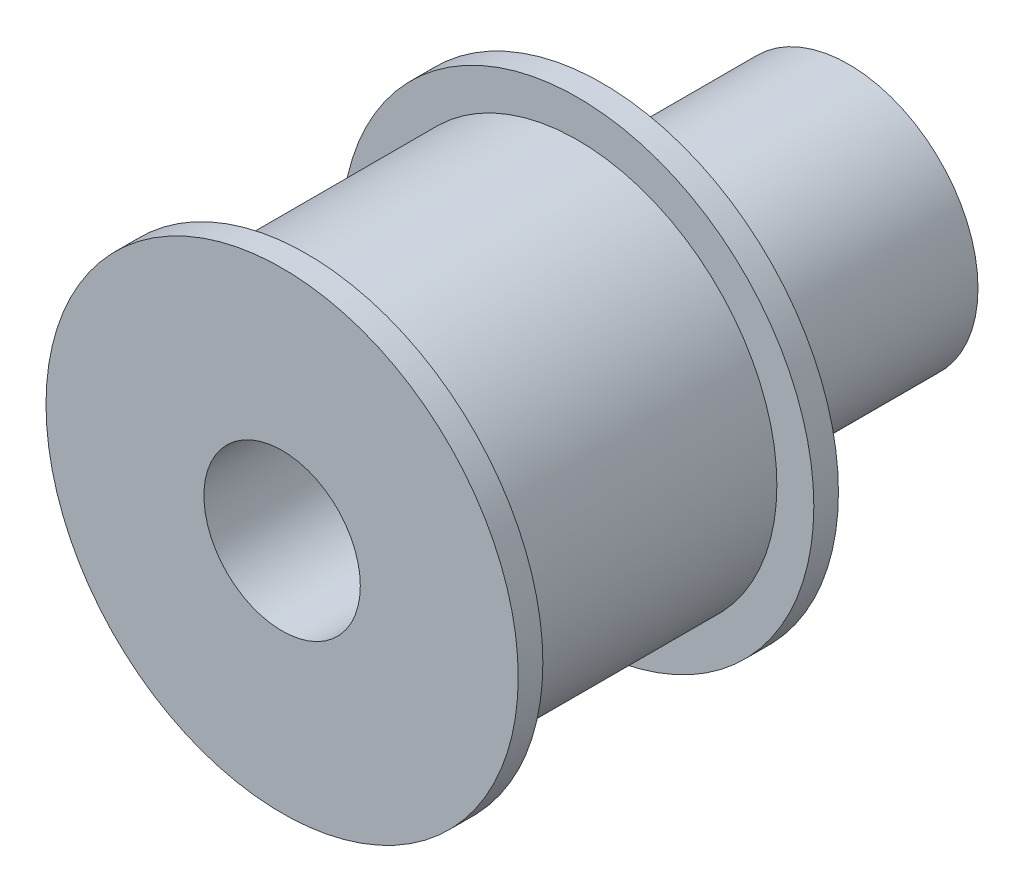
ISO-10303-21;
HEADER;
FILE_DESCRIPTION(('STEP AP214'),'2;1');
FILE_NAME('part.step','',(''),(''),'','','');
FILE_SCHEMA(('AUTOMOTIVE_DESIGN { 1 0 10303 214 1 1 1 1 }'));
ENDSEC;
DATA;
#1=APPLICATION_CONTEXT('core data for automotive mechanical design processes');
#2=APPLICATION_PROTOCOL_DEFINITION('international standard','automotive_design',2000,#1);
#3=PRODUCT_CONTEXT('',#1,'mechanical');
#4=PRODUCT('Part','Part','',(#3));
#5=PRODUCT_RELATED_PRODUCT_CATEGORY('part','',(#4));
#6=PRODUCT_DEFINITION_FORMATION('','',#4);
#7=PRODUCT_DEFINITION_CONTEXT('part definition',#1,'design');
#8=PRODUCT_DEFINITION('design','',#6,#7);
#9=PRODUCT_DEFINITION_SHAPE('','',#8);
#10=(LENGTH_UNIT() NAMED_UNIT(*) SI_UNIT(.MILLI.,.METRE.));
#11=(NAMED_UNIT(*) PLANE_ANGLE_UNIT() SI_UNIT($,.RADIAN.));
#12=(NAMED_UNIT(*) SI_UNIT($,.STERADIAN.) SOLID_ANGLE_UNIT());
#13=UNCERTAINTY_MEASURE_WITH_UNIT(LENGTH_MEASURE(1.E-05),#10,'distance_accuracy_value','');
#14=(GEOMETRIC_REPRESENTATION_CONTEXT(3) GLOBAL_UNCERTAINTY_ASSIGNED_CONTEXT((#13)) GLOBAL_UNIT_ASSIGNED_CONTEXT((#10,
#11,#12)) REPRESENTATION_CONTEXT('',''));
#15=CARTESIAN_POINT('',(0.,0.,0.));
#16=DIRECTION('',(0.,0.,1.));
#17=DIRECTION('',(1.,0.,0.));
#18=AXIS2_PLACEMENT_3D('',#15,#16,#17);
#19=CARTESIAN_POINT('',(0.,0.,-23.));
#20=DIRECTION('',(0.,0.,1.));
#21=DIRECTION('',(1.,0.,0.));
#22=AXIS2_PLACEMENT_3D('',#19,#20,#21);
#23=PLANE('',#22);
#24=CARTESIAN_POINT('',(0.,0.,-23.));
#25=DIRECTION('',(0.,0.,1.));
#26=DIRECTION('',(1.,0.,0.));
#27=AXIS2_PLACEMENT_3D('',#24,#25,#26);
#28=CIRCLE('',#27,3.175);
#29=CARTESIAN_POINT('',(3.175,0.,-23.));
#30=VERTEX_POINT('',#29);
#31=EDGE_CURVE('E77',#30,#30,#28,.T.);
#32=ORIENTED_EDGE('',*,*,#31,.T.);
#33=EDGE_LOOP('',(#32));
#34=FACE_BOUND('',#33,.T.);
#35=CARTESIAN_POINT('',(0.,0.,-23.));
#36=DIRECTION('',(0.,0.,1.));
#37=DIRECTION('',(1.,0.,0.));
#38=AXIS2_PLACEMENT_3D('',#35,#36,#37);
#39=CIRCLE('',#38,5.24999999999998);
#40=CARTESIAN_POINT('',(5.24999999999998,0.,-23.));
#41=VERTEX_POINT('',#40);
#42=EDGE_CURVE('E10',#41,#41,#39,.T.);
#43=ORIENTED_EDGE('',*,*,#42,.F.);
#44=EDGE_LOOP('',(#43));
#45=FACE_BOUND('',#44,.T.);
#46=ADVANCED_FACE('F32',(#34,#45),#23,.F.);
#47=CARTESIAN_POINT('',(0.,0.,0.));
#48=DIRECTION('',(0.,0.,1.));
#49=DIRECTION('',(1.,0.,0.));
#50=AXIS2_PLACEMENT_3D('',#47,#48,#49);
#51=CYLINDRICAL_SURFACE('',#50,5.24999999999998);
#52=CARTESIAN_POINT('',(-5.24999999999998,0.,-19.5));
#53=CARTESIAN_POINT('',(-5.24999901970754,0.0824661767829382,-19.4999985453285));
#54=CARTESIAN_POINT('',(-5.2480381305153,0.164947310904436,-19.4931766582679));
#55=CARTESIAN_POINT('',(-5.24040679458825,0.32751899339774,-19.4661267974233));
#56=CARTESIAN_POINT('',(-5.23473494407561,0.40760862512221,-19.4458937504444));
#57=CARTESIAN_POINT('',(-5.22030518511802,0.563028225553401,-19.3927439711876));
#58=CARTESIAN_POINT('',(-5.21155158079754,0.638364660636167,-19.359844922886));
#59=CARTESIAN_POINT('',(-5.19187483737406,0.782451570846952,-19.2823665063912));
#60=CARTESIAN_POINT('',(-5.18095147131015,0.851201355883621,-19.2377859161322));
#61=CARTESIAN_POINT('',(-5.15778550969183,0.981970835144206,-19.1369737419953));
#62=CARTESIAN_POINT('',(-5.14551781458891,1.0437927917857,-19.0804914346085));
#63=CARTESIAN_POINT('',(-5.12120051186729,1.15722851844326,-18.9580141926467));
#64=CARTESIAN_POINT('',(-5.10915093719506,1.20884075780837,-18.8920178342758));
#65=CARTESIAN_POINT('',(-5.08637261156539,1.30139842504823,-18.7507548129068));
#66=CARTESIAN_POINT('',(-5.07567526879511,1.34210865827511,-18.6753285112013));
#67=CARTESIAN_POINT('',(-5.05718507880498,1.41018877915485,-18.5183459911869));
#68=CARTESIAN_POINT('',(-5.04939160683651,1.43756153666789,-18.4367910959468));
#69=CARTESIAN_POINT('',(-5.0378520614701,1.47748824760406,-18.2720739276258));
#70=CARTESIAN_POINT('',(-5.03400733927506,1.49040414902137,-18.1890064779241));
#71=CARTESIAN_POINT('',(-5.03050656151494,1.50218000841888,-18.0218016386654));
#72=CARTESIAN_POINT('',(-5.03084959580707,1.50104302057215,-17.9376644855623));
#73=CARTESIAN_POINT('',(-5.03559775807448,1.48503101072177,-17.7735985414079));
#74=CARTESIAN_POINT('',(-5.0398708702345,1.47060244296293,-17.6936217366144));
#75=CARTESIAN_POINT('',(-5.05178511287106,1.42913539564342,-17.5372745852793));
#76=CARTESIAN_POINT('',(-5.059426547823,1.40209577610937,-17.4609045654596));
#77=CARTESIAN_POINT('',(-5.07732647637058,1.33583010853359,-17.3128153166761));
#78=CARTESIAN_POINT('',(-5.08761687304234,1.29645413379661,-17.2411671956987));
#79=CARTESIAN_POINT('',(-5.10963912661542,1.20673784375913,-17.1053425790899));
#80=CARTESIAN_POINT('',(-5.12137130416432,1.15639508755008,-17.0411677516988));
#81=CARTESIAN_POINT('',(-5.14549687992265,1.04392799754766,-16.9195707182952));
#82=CARTESIAN_POINT('',(-5.15789853429272,0.981431156133995,-16.8624941430246));
#83=CARTESIAN_POINT('',(-5.18157185413756,0.847599211789669,-16.7595554972698));
#84=CARTESIAN_POINT('',(-5.19284346103367,0.776263651111419,-16.7136940079687));
#85=CARTESIAN_POINT('',(-5.21307396049124,0.626192304818584,-16.6343034489195));
#86=CARTESIAN_POINT('',(-5.2220195662292,0.547417363357504,-16.6008447848969));
#87=CARTESIAN_POINT('',(-5.23649438615687,0.385044922475603,-16.5477495814374));
#88=CARTESIAN_POINT('',(-5.24202446142189,0.301448644357611,-16.528109558066));
#89=CARTESIAN_POINT('',(-5.24891155886002,0.134749791483263,-16.5037700357179));
#90=CARTESIAN_POINT('',(-5.2503995463795,0.051721010145381,-16.4986014784702));
#91=CARTESIAN_POINT('',(-5.24941563530314,-0.114019895104186,-16.5020454497258));
#92=CARTESIAN_POINT('',(-5.24694421185461,-0.196732055817828,-16.5106563246344));
#93=CARTESIAN_POINT('',(-5.23840445013911,-0.357763975072737,-16.5410328332372));
#94=CARTESIAN_POINT('',(-5.2324095976329,-0.43613865880114,-16.5625298859926));
#95=CARTESIAN_POINT('',(-5.21750999056377,-0.58815651465422,-16.6177503764885));
#96=CARTESIAN_POINT('',(-5.2086048994928,-0.661799138436504,-16.6514752281669));
#97=CARTESIAN_POINT('',(-5.18857470876983,-0.804031263840053,-16.7310175024839));
#98=CARTESIAN_POINT('',(-5.17740572384229,-0.872476864905187,-16.7770808991193));
#99=CARTESIAN_POINT('',(-5.15413460323352,-1.00082889604448,-16.879689379463));
#100=CARTESIAN_POINT('',(-5.14203225564549,-1.06073337813182,-16.9362368475471));
#101=CARTESIAN_POINT('',(-5.11776464723918,-1.17232982125553,-17.0604070065384));
#102=CARTESIAN_POINT('',(-5.1056102765069,-1.22368907055715,-17.1283314566743));
#103=CARTESIAN_POINT('',(-5.08304171044124,-1.31429648704887,-17.2720969414635));
#104=CARTESIAN_POINT('',(-5.07262745456938,-1.35354507560828,-17.3479377005598));
#105=CARTESIAN_POINT('',(-5.0548398845807,-1.41853090589125,-17.5050684082438));
#106=CARTESIAN_POINT('',(-5.04745050118525,-1.44433974931832,-17.5863268226795));
#107=CARTESIAN_POINT('',(-5.03656842598249,-1.48184587553055,-17.7522824517408));
#108=CARTESIAN_POINT('',(-5.03307455346068,-1.49354743426741,-17.8369786163265));
#109=CARTESIAN_POINT('',(-5.03048777321361,-1.50223518184644,-18.0039720246911));
#110=CARTESIAN_POINT('',(-5.03123370599552,-1.49976020733171,-18.0862391284144));
#111=CARTESIAN_POINT('',(-5.03665947911097,-1.48143533218232,-18.2491310479993));
#112=CARTESIAN_POINT('',(-5.04133918817573,-1.4655858778494,-18.3297559185697));
#113=CARTESIAN_POINT('',(-5.05400232868672,-1.42129476612471,-18.4862837783756));
#114=CARTESIAN_POINT('',(-5.06195157786266,-1.39298318839764,-18.5622265402581));
#115=CARTESIAN_POINT('',(-5.08025477132044,-1.32467211976195,-18.7083440508693));
#116=CARTESIAN_POINT('',(-5.09060914111917,-1.28467056032366,-18.778517775955));
#117=CARTESIAN_POINT('',(-5.11298751712319,-1.19254909901118,-18.9136376413539));
#118=CARTESIAN_POINT('',(-5.12505572384261,-1.14006920792048,-18.9783310435064));
#119=CARTESIAN_POINT('',(-5.14927383819206,-1.02514488028451,-19.0981679218574));
#120=CARTESIAN_POINT('',(-5.16142376562883,-0.962697938046417,-19.1533089893331));
#121=CARTESIAN_POINT('',(-5.18480969679262,-0.827680740649041,-19.253877888245));
#122=CARTESIAN_POINT('',(-5.19601425778055,-0.754891876769833,-19.2990202404522));
#123=CARTESIAN_POINT('',(-5.21588546833479,-0.602437897234995,-19.3763593387665));
#124=CARTESIAN_POINT('',(-5.22455350402714,-0.522776568086055,-19.4085631589498));
#125=CARTESIAN_POINT('',(-5.23745508543978,-0.369687236501277,-19.4556356635466));
#126=CARTESIAN_POINT('',(-5.24212263271555,-0.296822255718294,-19.4722301525134));
#127=CARTESIAN_POINT('',(-5.24839532889108,-0.149308776589776,-19.4944122429316));
#128=CARTESIAN_POINT('',(-5.25000088750495,-0.0746605182120689,-19.5000013169826));
#129=CARTESIAN_POINT('',(-5.24999999999998,0.,-19.5));
#130=B_SPLINE_CURVE_WITH_KNOTS('',3,(#52,#53,#54,#55,#56,#57,#58,#59,#60,#61,#62,#63,#64,#65,
#66,#67,#68,#69,#70,#71,#72,#73,#74,#75,#76,#77,#78,#79,#80,#81,#82,#83,#84,#85,#86,#87,#88,#89,
#90,#91,#92,#93,#94,#95,#96,#97,#98,#99,#100,#101,#102,#103,#104,#105,#106,#107,#108,#109,#110,
#111,#112,#113,#114,#115,#116,#117,#118,#119,#120,#121,#122,#123,#124,#125,#126,#127,#128,#129),
.UNSPECIFIED.,.T.,.F.,(4,2,2,2,2,2,2,2,2,2,2,2,2,2,2,2,2,2,2,2,2,2,2,2,2,2,2,2,2,2,2,2,2,2,2,2,
2,2,4),(0.,0.247124484406757,0.494342504846383,0.741216609671505,0.988116551576367,
1.24085858648086,1.49363848405285,1.75149806475043,2.00930213658607,2.26049632397062,
2.51163591923424,2.75463589371999,2.99765783839594,3.24375602468407,3.48990904183006,
3.74533875451875,4.00078170116586,4.25765325828335,4.51446003010958,4.76284093273649,
5.01119203075985,5.25453855359638,5.49791322431646,5.74655644008337,5.99525627390839,
6.2520907866325,6.50891636223972,6.76435930022605,7.01972479336602,7.26545011208156,
7.51116723135286,7.7543782221425,7.99763227493983,8.24900742663574,8.50044587327155,
8.75833484223424,9.01608261921366,9.2398460102426,9.46357945816589),.UNSPECIFIED.);
#131=CARTESIAN_POINT('',(-5.24999999999998,0.,-19.5));
#132=VERTEX_POINT('',#131);
#133=EDGE_CURVE('E57',#132,#132,#130,.T.);
#134=ORIENTED_EDGE('',*,*,#133,.T.);
#135=EDGE_LOOP('',(#134));
#136=FACE_BOUND('',#135,.T.);
#137=CARTESIAN_POINT('',(0.,-5.24999999999998,-16.5));
#138=CARTESIAN_POINT('',(0.0824661767829383,-5.24999901970754,-16.5000014546714));
#139=CARTESIAN_POINT('',(0.164947310904436,-5.2480381305153,-16.5068233417321));
#140=CARTESIAN_POINT('',(0.327518993397741,-5.24040679458825,-16.5338732025767));
#141=CARTESIAN_POINT('',(0.407608625122211,-5.23473494407561,-16.5541062495556));
#142=CARTESIAN_POINT('',(0.563028225553402,-5.22030518511803,-16.6072560288124));
#143=CARTESIAN_POINT('',(0.638364660636167,-5.21155158079754,-16.6401550771139));
#144=CARTESIAN_POINT('',(0.782451570846953,-5.19187483737406,-16.7176334936087));
#145=CARTESIAN_POINT('',(0.851201355883623,-5.18095147131015,-16.7622140838678));
#146=CARTESIAN_POINT('',(0.981970835144208,-5.15778550969183,-16.8630262580047));
#147=CARTESIAN_POINT('',(1.0437927917857,-5.14551781458891,-16.9195085653914));
#148=CARTESIAN_POINT('',(1.15722851844326,-5.12120051186729,-17.0419858073532));
#149=CARTESIAN_POINT('',(1.20884075780837,-5.10915093719505,-17.1079821657242));
#150=CARTESIAN_POINT('',(1.30139842504823,-5.08637261156539,-17.2492451870932));
#151=CARTESIAN_POINT('',(1.34210865827511,-5.07567526879511,-17.3246714887986));
#152=CARTESIAN_POINT('',(1.41018877915485,-5.05718507880498,-17.4816540088131));
#153=CARTESIAN_POINT('',(1.43756153666789,-5.04939160683651,-17.5632089040532));
#154=CARTESIAN_POINT('',(1.47748824760406,-5.0378520614701,-17.7279260723741));
#155=CARTESIAN_POINT('',(1.49040414902137,-5.03400733927506,-17.8109935220759));
#156=CARTESIAN_POINT('',(1.50218000841888,-5.03050656151494,-17.9781983613346));
#157=CARTESIAN_POINT('',(1.50104302057216,-5.03084959580706,-18.0623355144377));
#158=CARTESIAN_POINT('',(1.48503101072177,-5.03559775807448,-18.2264014585921));
#159=CARTESIAN_POINT('',(1.47060244296293,-5.0398708702345,-18.3063782633856));
#160=CARTESIAN_POINT('',(1.42913539564342,-5.05178511287106,-18.4627254147207));
#161=CARTESIAN_POINT('',(1.40209577610937,-5.059426547823,-18.5390954345404));
#162=CARTESIAN_POINT('',(1.33583010853359,-5.07732647637058,-18.6871846833238));
#163=CARTESIAN_POINT('',(1.29645413379661,-5.08761687304234,-18.7588328043012));
#164=CARTESIAN_POINT('',(1.20673784375914,-5.10963912661542,-18.89465742091));
#165=CARTESIAN_POINT('',(1.15639508755009,-5.12137130416432,-18.9588322483012));
#166=CARTESIAN_POINT('',(1.04392799754766,-5.14549687992264,-19.0804292817048));
#167=CARTESIAN_POINT('',(0.981431156133997,-5.15789853429272,-19.1375058569754));
#168=CARTESIAN_POINT('',(0.84759921178967,-5.18157185413756,-19.2404445027302));
#169=CARTESIAN_POINT('',(0.77626365111142,-5.19284346103367,-19.2863059920313));
#170=CARTESIAN_POINT('',(0.626192304818584,-5.21307396049124,-19.3656965510805));
#171=CARTESIAN_POINT('',(0.547417363357504,-5.2220195662292,-19.3991552151031));
#172=CARTESIAN_POINT('',(0.385044922475603,-5.23649438615687,-19.4522504185626));
#173=CARTESIAN_POINT('',(0.301448644357611,-5.24202446142189,-19.4718904419339));
#174=CARTESIAN_POINT('',(0.134749791483264,-5.24891155886002,-19.4962299642821));
#175=CARTESIAN_POINT('',(0.0517210101453814,-5.2503995463795,-19.5013985215298));
#176=CARTESIAN_POINT('',(-0.114019895104186,-5.24941563530314,-19.4979545502742));
#177=CARTESIAN_POINT('',(-0.196732055817828,-5.24694421185461,-19.4893436753656));
#178=CARTESIAN_POINT('',(-0.357763975072738,-5.23840445013911,-19.4589671667628));
#179=CARTESIAN_POINT('',(-0.436138658801141,-5.2324095976329,-19.4374701140074));
#180=CARTESIAN_POINT('',(-0.588156514654222,-5.21750999056377,-19.3822496235115));
#181=CARTESIAN_POINT('',(-0.661799138436505,-5.2086048994928,-19.3485247718331));
#182=CARTESIAN_POINT('',(-0.804031263840055,-5.18857470876983,-19.2689824975161));
#183=CARTESIAN_POINT('',(-0.87247686490519,-5.17740572384229,-19.2229191008806));
#184=CARTESIAN_POINT('',(-1.00082889604448,-5.15413460323352,-19.120310620537));
#185=CARTESIAN_POINT('',(-1.06073337813182,-5.14203225564549,-19.0637631524528));
#186=CARTESIAN_POINT('',(-1.17232982125553,-5.11776464723918,-18.9395929934616));
#187=CARTESIAN_POINT('',(-1.22368907055715,-5.1056102765069,-18.8716685433257));
#188=CARTESIAN_POINT('',(-1.31429648704887,-5.08304171044124,-18.7279030585365));
#189=CARTESIAN_POINT('',(-1.35354507560828,-5.07262745456938,-18.6520622994402));
#190=CARTESIAN_POINT('',(-1.41853090589126,-5.0548398845807,-18.4949315917562));
#191=CARTESIAN_POINT('',(-1.44433974931832,-5.04745050118525,-18.4136731773205));
#192=CARTESIAN_POINT('',(-1.48184587553056,-5.03656842598249,-18.2477175482592));
#193=CARTESIAN_POINT('',(-1.49354743426742,-5.03307455346068,-18.1630213836735));
#194=CARTESIAN_POINT('',(-1.50223518184644,-5.03048777321361,-17.9960279753088));
#195=CARTESIAN_POINT('',(-1.49976020733171,-5.03123370599552,-17.9137608715855));
#196=CARTESIAN_POINT('',(-1.48143533218232,-5.03665947911097,-17.7508689520007));
#197=CARTESIAN_POINT('',(-1.4655858778494,-5.04133918817572,-17.6702440814302));
#198=CARTESIAN_POINT('',(-1.42129476612471,-5.05400232868671,-17.5137162216243));
#199=CARTESIAN_POINT('',(-1.39298318839765,-5.06195157786266,-17.4377734597418));
#200=CARTESIAN_POINT('',(-1.32467211976195,-5.08025477132043,-17.2916559491306));
#201=CARTESIAN_POINT('',(-1.28467056032367,-5.09060914111917,-17.221482224045));
#202=CARTESIAN_POINT('',(-1.19254909901119,-5.11298751712319,-17.0863623586461));
#203=CARTESIAN_POINT('',(-1.14006920792048,-5.12505572384261,-17.0216689564935));
#204=CARTESIAN_POINT('',(-1.02514488028452,-5.14927383819206,-16.9018320781426));
#205=CARTESIAN_POINT('',(-0.962697938046422,-5.16142376562883,-16.8466910106669));
#206=CARTESIAN_POINT('',(-0.827680740649046,-5.18480969679262,-16.746122111755));
#207=CARTESIAN_POINT('',(-0.754891876769839,-5.19601425778055,-16.7009797595478));
#208=CARTESIAN_POINT('',(-0.602437897235,-5.21588546833479,-16.6236406612335));
#209=CARTESIAN_POINT('',(-0.522776568086058,-5.22455350402714,-16.5914368410502));
#210=CARTESIAN_POINT('',(-0.369687236501278,-5.23745508543978,-16.5443643364534));
#211=CARTESIAN_POINT('',(-0.296822255718294,-5.24212263271555,-16.5277698474866));
#212=CARTESIAN_POINT('',(-0.149308776589775,-5.24839532889108,-16.5055877570684));
#213=CARTESIAN_POINT('',(-0.0746605182120688,-5.25000088750495,-16.4999986830173));
#214=CARTESIAN_POINT('',(0.,-5.24999999999998,-16.5));
#215=B_SPLINE_CURVE_WITH_KNOTS('',3,(#137,#138,#139,#140,#141,#142,#143,#144,#145,#146,#147,
#148,#149,#150,#151,#152,#153,#154,#155,#156,#157,#158,#159,#160,#161,#162,#163,#164,#165,#166,
#167,#168,#169,#170,#171,#172,#173,#174,#175,#176,#177,#178,#179,#180,#181,#182,#183,#184,#185,
#186,#187,#188,#189,#190,#191,#192,#193,#194,#195,#196,#197,#198,#199,#200,#201,#202,#203,#204,
#205,#206,#207,#208,#209,#210,#211,#212,#213,#214),.UNSPECIFIED.,.T.,.F.,(4,2,2,2,2,2,2,2,2,2,2,
2,2,2,2,2,2,2,2,2,2,2,2,2,2,2,2,2,2,2,2,2,2,2,2,2,2,2,4),(0.,0.247124484406758,
0.494342504846384,0.741216609671505,0.988116551576369,1.24085858648086,1.49363848405285,
1.75149806475043,2.00930213658607,2.26049632397063,2.51163591923425,2.75463589372,
2.99765783839594,3.24375602468408,3.48990904183007,3.74533875451876,4.00078170116587,
4.25765325828336,4.51446003010959,4.7628409327365,5.01119203075986,5.2545385535964,
5.49791322431647,5.74655644008339,5.99525627390841,6.25209078663251,6.50891636223974,
6.76435930022607,7.01972479336604,7.26545011208158,7.51116723135287,7.75437822214251,
7.99763227493985,8.24900742663575,8.50044587327157,8.75833484223425,9.01608261921368,
9.23984601024262,9.46357945816592),.UNSPECIFIED.);
#216=CARTESIAN_POINT('',(0.,-5.24999999999998,-16.5));
#217=VERTEX_POINT('',#216);
#218=EDGE_CURVE('E56',#217,#217,#215,.T.);
#219=ORIENTED_EDGE('',*,*,#218,.T.);
#220=EDGE_LOOP('',(#219));
#221=FACE_BOUND('',#220,.T.);
#222=CARTESIAN_POINT('',(0.,0.,-13.));
#223=DIRECTION('',(0.,0.,1.));
#224=DIRECTION('',(1.,0.,0.));
#225=AXIS2_PLACEMENT_3D('',#222,#223,#224);
#226=CIRCLE('',#225,5.24999999999998);
#227=CARTESIAN_POINT('',(5.24999999999998,0.,-13.));
#228=VERTEX_POINT('',#227);
#229=EDGE_CURVE('E43',#228,#228,#226,.T.);
#230=ORIENTED_EDGE('',*,*,#229,.F.);
#231=EDGE_LOOP('',(#230));
#232=FACE_BOUND('',#231,.T.);
#233=ORIENTED_EDGE('',*,*,#42,.T.);
#234=EDGE_LOOP('',(#233));
#235=FACE_BOUND('',#234,.T.);
#236=ADVANCED_FACE('F79',(#136,#221,#232,#235),#51,.T.);
#237=CARTESIAN_POINT('',(-5.24999999999998,0.,-13.));
#238=DIRECTION('',(0.,0.,1.));
#239=DIRECTION('',(1.,0.,0.));
#240=AXIS2_PLACEMENT_3D('',#237,#238,#239);
#241=PLANE('',#240);
#242=CARTESIAN_POINT('',(0.,0.,-13.));
#243=DIRECTION('',(0.,0.,1.));
#244=DIRECTION('',(1.,0.,0.));
#245=AXIS2_PLACEMENT_3D('',#242,#243,#244);
#246=CIRCLE('',#245,9.58507110906828);
#247=CARTESIAN_POINT('',(9.58507110906828,0.,-13.));
#248=VERTEX_POINT('',#247);
#249=EDGE_CURVE('E48',#248,#248,#246,.T.);
#250=ORIENTED_EDGE('',*,*,#249,.F.);
#251=EDGE_LOOP('',(#250));
#252=FACE_BOUND('',#251,.T.);
#253=ORIENTED_EDGE('',*,*,#229,.T.);
#254=EDGE_LOOP('',(#253));
#255=FACE_BOUND('',#254,.T.);
#256=ADVANCED_FACE('F83',(#252,#255),#241,.F.);
#257=CARTESIAN_POINT('',(0.,0.,0.));
#258=DIRECTION('',(0.,0.,1.));
#259=DIRECTION('',(1.,0.,0.));
#260=AXIS2_PLACEMENT_3D('',#257,#258,#259);
#261=CYLINDRICAL_SURFACE('',#260,9.58507110906828);
#262=CARTESIAN_POINT('',(0.,0.,-12.));
#263=DIRECTION('',(0.,0.,1.));
#264=DIRECTION('',(1.,0.,0.));
#265=AXIS2_PLACEMENT_3D('',#262,#263,#264);
#266=CIRCLE('',#265,9.58507110906828);
#267=CARTESIAN_POINT('',(9.58507110906828,0.,-12.));
#268=VERTEX_POINT('',#267);
#269=EDGE_CURVE('E140',#268,#268,#266,.T.);
#270=ORIENTED_EDGE('',*,*,#269,.F.);
#271=EDGE_LOOP('',(#270));
#272=FACE_BOUND('',#271,.T.);
#273=ORIENTED_EDGE('',*,*,#249,.T.);
#274=EDGE_LOOP('',(#273));
#275=FACE_BOUND('',#274,.T.);
#276=ADVANCED_FACE('F88',(#272,#275),#261,.T.);
#277=CARTESIAN_POINT('',(-9.58507110906828,0.,-12.));
#278=DIRECTION('',(0.,0.,-1.));
#279=DIRECTION('',(-1.,0.,0.));
#280=AXIS2_PLACEMENT_3D('',#277,#278,#279);
#281=PLANE('',#280);
#282=CARTESIAN_POINT('',(0.,0.,-12.));
#283=DIRECTION('',(0.,0.,1.));
#284=DIRECTION('',(1.,0.,0.));
#285=AXIS2_PLACEMENT_3D('',#282,#283,#284);
#286=CIRCLE('',#285,8.08507110906828);
#287=CARTESIAN_POINT('',(8.08507110906828,0.,-12.));
#288=VERTEX_POINT('',#287);
#289=EDGE_CURVE('E137',#288,#288,#286,.T.);
#290=ORIENTED_EDGE('',*,*,#289,.F.);
#291=EDGE_LOOP('',(#290));
#292=FACE_BOUND('',#291,.T.);
#293=ORIENTED_EDGE('',*,*,#269,.T.);
#294=EDGE_LOOP('',(#293));
#295=FACE_BOUND('',#294,.T.);
#296=ADVANCED_FACE('F92',(#292,#295),#281,.F.);
#297=CARTESIAN_POINT('',(0.,0.,0.));
#298=DIRECTION('',(0.,0.,1.));
#299=DIRECTION('',(1.,0.,0.));
#300=AXIS2_PLACEMENT_3D('',#297,#298,#299);
#301=CYLINDRICAL_SURFACE('',#300,8.08507110906828);
#302=CARTESIAN_POINT('',(0.,0.,-1.));
#303=DIRECTION('',(0.,0.,1.));
#304=DIRECTION('',(1.,0.,0.));
#305=AXIS2_PLACEMENT_3D('',#302,#303,#304);
#306=CIRCLE('',#305,8.08507110906828);
#307=CARTESIAN_POINT('',(8.08507110906828,0.,-1.));
#308=VERTEX_POINT('',#307);
#309=EDGE_CURVE('E134',#308,#308,#306,.T.);
#310=ORIENTED_EDGE('',*,*,#309,.F.);
#311=EDGE_LOOP('',(#310));
#312=FACE_BOUND('',#311,.T.);
#313=ORIENTED_EDGE('',*,*,#289,.T.);
#314=EDGE_LOOP('',(#313));
#315=FACE_BOUND('',#314,.T.);
#316=ADVANCED_FACE('F96',(#312,#315),#301,.T.);
#317=CARTESIAN_POINT('',(-8.08507110906828,0.,-1.));
#318=DIRECTION('',(0.,0.,1.));
#319=DIRECTION('',(1.,0.,0.));
#320=AXIS2_PLACEMENT_3D('',#317,#318,#319);
#321=PLANE('',#320);
#322=CARTESIAN_POINT('',(0.,0.,-1.));
#323=DIRECTION('',(0.,0.,1.));
#324=DIRECTION('',(1.,0.,0.));
#325=AXIS2_PLACEMENT_3D('',#322,#323,#324);
#326=CIRCLE('',#325,9.58507110906828);
#327=CARTESIAN_POINT('',(9.58507110906828,0.,-1.));
#328=VERTEX_POINT('',#327);
#329=EDGE_CURVE('E127',#328,#328,#326,.T.);
#330=ORIENTED_EDGE('',*,*,#329,.F.);
#331=EDGE_LOOP('',(#330));
#332=FACE_BOUND('',#331,.T.);
#333=ORIENTED_EDGE('',*,*,#309,.T.);
#334=EDGE_LOOP('',(#333));
#335=FACE_BOUND('',#334,.T.);
#336=ADVANCED_FACE('F100',(#332,#335),#321,.F.);
#337=CARTESIAN_POINT('',(0.,0.,0.));
#338=DIRECTION('',(0.,0.,1.));
#339=DIRECTION('',(1.,0.,0.));
#340=AXIS2_PLACEMENT_3D('',#337,#338,#339);
#341=CYLINDRICAL_SURFACE('',#340,9.58507110906829);
#342=CARTESIAN_POINT('',(0.,0.,0.));
#343=DIRECTION('',(0.,0.,1.));
#344=DIRECTION('',(1.,0.,0.));
#345=AXIS2_PLACEMENT_3D('',#342,#343,#344);
#346=CIRCLE('',#345,9.58507110906829);
#347=CARTESIAN_POINT('',(9.58507110906829,0.,0.));
#348=VERTEX_POINT('',#347);
#349=EDGE_CURVE('E125',#348,#348,#346,.T.);
#350=ORIENTED_EDGE('',*,*,#349,.F.);
#351=EDGE_LOOP('',(#350));
#352=FACE_BOUND('',#351,.T.);
#353=ORIENTED_EDGE('',*,*,#329,.T.);
#354=EDGE_LOOP('',(#353));
#355=FACE_BOUND('',#354,.T.);
#356=ADVANCED_FACE('F104',(#352,#355),#341,.T.);
#357=CARTESIAN_POINT('',(-9.58507110906829,0.,0.));
#358=DIRECTION('',(0.,0.,-1.));
#359=DIRECTION('',(-1.,0.,0.));
#360=AXIS2_PLACEMENT_3D('',#357,#358,#359);
#361=PLANE('',#360);
#362=CARTESIAN_POINT('',(0.,0.,0.));
#363=DIRECTION('',(0.,0.,1.));
#364=DIRECTION('',(1.,0.,0.));
#365=AXIS2_PLACEMENT_3D('',#362,#363,#364);
#366=CIRCLE('',#365,3.175);
#367=CARTESIAN_POINT('',(3.175,0.,0.));
#368=VERTEX_POINT('',#367);
#369=EDGE_CURVE('E74',#368,#368,#366,.T.);
#370=ORIENTED_EDGE('',*,*,#369,.F.);
#371=EDGE_LOOP('',(#370));
#372=FACE_BOUND('',#371,.T.);
#373=ORIENTED_EDGE('',*,*,#349,.T.);
#374=EDGE_LOOP('',(#373));
#375=FACE_BOUND('',#374,.T.);
#376=ADVANCED_FACE('F107',(#372,#375),#361,.F.);
#377=CARTESIAN_POINT('',(0.,0.,-23.));
#378=DIRECTION('',(0.,0.,1.));
#379=DIRECTION('',(1.,0.,0.));
#380=AXIS2_PLACEMENT_3D('',#377,#378,#379);
#381=CYLINDRICAL_SURFACE('',#380,3.175);
#382=CARTESIAN_POINT('',(-3.175,0.,-19.5));
#383=CARTESIAN_POINT('',(-3.17499621985295,-0.0793696056331876,-19.4999955261035));
#384=CARTESIAN_POINT('',(-3.17199120370814,-0.158848966213319,-19.4936633534842));
#385=CARTESIAN_POINT('',(-3.16026762742416,-0.315490796657699,-19.4685996128575));
#386=CARTESIAN_POINT('',(-3.15153670753249,-0.392647876041671,-19.4498412211257));
#387=CARTESIAN_POINT('',(-3.12928185140191,-0.542134614016448,-19.4008046338603));
#388=CARTESIAN_POINT('',(-3.11577583396693,-0.614481134826972,-19.370569474688));
#389=CARTESIAN_POINT('',(-3.08523557557938,-0.752982757479878,-19.2996444683174));
#390=CARTESIAN_POINT('',(-3.06820187122341,-0.819138798737002,-19.2589562109142));
#391=CARTESIAN_POINT('',(-3.03109215002452,-0.94753197755139,-19.1656866275469));
#392=CARTESIAN_POINT('',(-3.0108994960739,-1.00934531536298,-19.1125689176526));
#393=CARTESIAN_POINT('',(-2.97016877751052,-1.12356872804671,-18.997094015418));
#394=CARTESIAN_POINT('',(-2.94963048974006,-1.17597245123061,-18.9347306335115));
#395=CARTESIAN_POINT('',(-2.90895734211162,-1.27340721108708,-18.7974843645497));
#396=CARTESIAN_POINT('',(-2.88894252906623,-1.31770529611401,-18.7220415431448));
#397=CARTESIAN_POINT('',(-2.85350194913633,-1.39279860497067,-18.5637145060508));
#398=CARTESIAN_POINT('',(-2.83807319122875,-1.4236026358555,-18.4808351865709));
#399=CARTESIAN_POINT('',(-2.81484981523147,-1.46896762087975,-18.3148173299765));
#400=CARTESIAN_POINT('',(-2.80667245171199,-1.48434942407678,-18.2319591045865));
#401=CARTESIAN_POINT('',(-2.79782290647243,-1.50096994970779,-18.0644666996695));
#402=CARTESIAN_POINT('',(-2.79714463118969,-1.5022201551264,-17.9798340180599));
#403=CARTESIAN_POINT('',(-2.80305593263809,-1.49114871052962,-17.8206246914023));
#404=CARTESIAN_POINT('',(-2.80889771224103,-1.48022366031688,-17.7459168405556));
#405=CARTESIAN_POINT('',(-2.82589657910715,-1.44750469243097,-17.5995553191352));
#406=CARTESIAN_POINT('',(-2.83705508237193,-1.42570787921159,-17.5279024677406));
#407=CARTESIAN_POINT('',(-2.86368711079333,-1.37144042107045,-17.3876785427478));
#408=CARTESIAN_POINT('',(-2.87925460442575,-1.33873421633753,-17.3192173067294));
#409=CARTESIAN_POINT('',(-2.91294481240157,-1.26375034917988,-17.1884442293082));
#410=CARTESIAN_POINT('',(-2.93106865023239,-1.22146847336964,-17.1261351122786));
#411=CARTESIAN_POINT('',(-2.97027967308476,-1.12301829304093,-17.0021139821014));
#412=CARTESIAN_POINT('',(-2.99147184174414,-1.06582685913966,-16.9412446582645));
#413=CARTESIAN_POINT('',(-3.03276969244738,-0.941911654521737,-16.8296330789879));
#414=CARTESIAN_POINT('',(-3.05287495516681,-0.875184240523146,-16.7788947119872));
#415=CARTESIAN_POINT('',(-3.09065813188422,-0.730900451942524,-16.6872344695054));
#416=CARTESIAN_POINT('',(-3.10821737934191,-0.653032764749389,-16.6467498749094));
#417=CARTESIAN_POINT('',(-3.13795896561378,-0.490549806409963,-16.5797651472587));
#418=CARTESIAN_POINT('',(-3.15014513198242,-0.405939389394615,-16.5532550567205));
#419=CARTESIAN_POINT('',(-3.16698849385516,-0.239325331183661,-16.5169532783005));
#420=CARTESIAN_POINT('',(-3.17215069636453,-0.157618085372367,-16.5060369777487));
#421=CARTESIAN_POINT('',(-3.17605374308904,0.0066200623733424,-16.4977654982747));
#422=CARTESIAN_POINT('',(-3.17479716715133,0.0891506200914332,-16.500404871034));
#423=CARTESIAN_POINT('',(-3.16631250425399,0.246790904756255,-16.5184589502259));
#424=CARTESIAN_POINT('',(-3.15949303898597,0.322025617263289,-16.5329996821211));
#425=CARTESIAN_POINT('',(-3.14106249856194,0.468859911387633,-16.5731274662938));
#426=CARTESIAN_POINT('',(-3.12945086824545,0.540459070755478,-16.5987157984244));
#427=CARTESIAN_POINT('',(-3.10206629000487,0.680482664613305,-16.6609727759805));
#428=CARTESIAN_POINT('',(-3.08617757605381,0.748744433690324,-16.6979545958558));
#429=CARTESIAN_POINT('',(-3.0518284264566,0.878333413113472,-16.7816054255488));
#430=CARTESIAN_POINT('',(-3.0333668635778,0.93965756245344,-16.8282786858565));
#431=CARTESIAN_POINT('',(-2.99374847615918,1.05944471500474,-16.9348401643062));
#432=CARTESIAN_POINT('',(-2.97249840501299,1.11715821701518,-16.9955380300825));
#433=CARTESIAN_POINT('',(-2.9310107026401,1.22187582163969,-17.1259200433733));
#434=CARTESIAN_POINT('',(-2.91077359415055,1.26887443843489,-17.1956087655742));
#435=CARTESIAN_POINT('',(-2.8729842223829,1.3523177360002,-17.3451586056997));
#436=CARTESIAN_POINT('',(-2.85555063245794,1.3883357483136,-17.4252902768506));
#437=CARTESIAN_POINT('',(-2.82679504093384,1.44599796651068,-17.5915757360809));
#438=CARTESIAN_POINT('',(-2.81546607860886,1.46765854978946,-17.6777225382813));
#439=CARTESIAN_POINT('',(-2.8014814830717,1.49416555358527,-17.845136597093));
#440=CARTESIAN_POINT('',(-2.79812792823293,1.50036748851185,-17.9261304717313));
#441=CARTESIAN_POINT('',(-2.79854075870542,1.4995991124721,-18.0880256718279));
#442=CARTESIAN_POINT('',(-2.80230499174775,1.49263278331129,-18.1689270178634));
#443=CARTESIAN_POINT('',(-2.8158210937383,1.46695547456854,-18.3218618581667));
#444=CARTESIAN_POINT('',(-2.82509293077013,1.44918362899974,-18.394100315709));
#445=CARTESIAN_POINT('',(-2.84807658169596,1.40347262111118,-18.5345289541074));
#446=CARTESIAN_POINT('',(-2.86178973121638,1.37553039996267,-18.6027179098565));
#447=CARTESIAN_POINT('',(-2.89323433363553,1.30816165903835,-18.7381105518292));
#448=CARTESIAN_POINT('',(-2.9111726221189,1.26809407534009,-18.8049459695603));
#449=CARTESIAN_POINT('',(-2.94862781691945,1.17838069734069,-18.9313607981843));
#450=CARTESIAN_POINT('',(-2.96814547541437,1.12873032344155,-18.9909367174796));
#451=CARTESIAN_POINT('',(-3.00898948839188,1.01518945377103,-19.1075560784686));
#452=CARTESIAN_POINT('',(-3.03029315236505,0.95035554090853,-19.1636938134171));
#453=CARTESIAN_POINT('',(-3.07039060771354,0.81150644620123,-19.2644417542749));
#454=CARTESIAN_POINT('',(-3.08918318329392,0.737486850130154,-19.3090463858981));
#455=CARTESIAN_POINT('',(-3.12214803509559,0.582310323359665,-19.3850463197749));
#456=CARTESIAN_POINT('',(-3.13633626105317,0.501179295246571,-19.4164873338392));
#457=CARTESIAN_POINT('',(-3.15849550789229,0.334041202489529,-19.4649024240255));
#458=CARTESIAN_POINT('',(-3.16648489362115,0.248049357078896,-19.4819192475962));
#459=CARTESIAN_POINT('',(-3.17226666174443,0.134449327489633,-19.4942064333984));
#460=CARTESIAN_POINT('',(-3.17328951708221,0.107619750816228,-19.4963765519968));
#461=CARTESIAN_POINT('',(-3.17465683516496,0.0538643319459672,-19.4992741103809));
#462=CARTESIAN_POINT('',(-3.17500128300303,0.0269384876468125,-19.5000015184655));
#463=CARTESIAN_POINT('',(-3.175,0.,-19.5));
#464=B_SPLINE_CURVE_WITH_KNOTS('',3,(#382,#383,#384,#385,#386,#387,#388,#389,#390,#391,#392,
#393,#394,#395,#396,#397,#398,#399,#400,#401,#402,#403,#404,#405,#406,#407,#408,#409,#410,#411,
#412,#413,#414,#415,#416,#417,#418,#419,#420,#421,#422,#423,#424,#425,#426,#427,#428,#429,#430,
#431,#432,#433,#434,#435,#436,#437,#438,#439,#440,#441,#442,#443,#444,#445,#446,#447,#448,#449,
#450,#451,#452,#453,#454,#455,#456,#457,#458,#459,#460,#461,#462,#463),.UNSPECIFIED.,.T.,.F.,(4,
2,2,2,2,2,2,2,2,2,2,2,2,2,2,2,2,2,2,2,2,2,2,2,2,2,2,2,2,2,2,2,2,2,2,2,2,2,2,2,4),(0.,
0.237998863435126,0.47651316203436,0.714141760487183,0.951734239756922,1.202566267352,
1.45356698050229,1.72144991719772,1.98915775546694,2.24170968929962,2.4940563909499,
2.72018464462581,2.94637315667183,3.17780125644151,3.40933138528567,3.66670059385931,
3.92416839616742,4.19124985366181,4.45814074508091,4.70459764976703,4.95095550583969,
5.18069145066331,5.41045401730285,5.64720089890938,5.88405183355052,6.14213867221334,
6.40035735120201,6.66760822573516,6.93455372246491,7.17710763594644,7.41958821796885,
7.64352093670393,7.8675210608749,8.10644389425157,8.34548119240927,8.60934561245706,
8.87333732850239,9.13640455025373,9.39868939422997,9.47946576344204,9.56024390756226),.UNSPECIFIED.);
#465=CARTESIAN_POINT('',(-3.175,0.,-19.5));
#466=VERTEX_POINT('',#465);
#467=EDGE_CURVE('E35',#466,#466,#464,.T.);
#468=ORIENTED_EDGE('',*,*,#467,.T.);
#469=EDGE_LOOP('',(#468));
#470=FACE_BOUND('',#469,.T.);
#471=CARTESIAN_POINT('',(0.,-3.175,-16.5));
#472=CARTESIAN_POINT('',(-0.0793696056331877,-3.17499621985295,-16.5000044738965));
#473=CARTESIAN_POINT('',(-0.158848966213319,-3.17199120370814,-16.5063366465158));
#474=CARTESIAN_POINT('',(-0.3154907966577,-3.16026762742416,-16.5314003871425));
#475=CARTESIAN_POINT('',(-0.392647876041672,-3.15153670753249,-16.5501587788742));
#476=CARTESIAN_POINT('',(-0.542134614016448,-3.12928185140191,-16.5991953661397));
#477=CARTESIAN_POINT('',(-0.614481134826972,-3.11577583396693,-16.6294305253119));
#478=CARTESIAN_POINT('',(-0.752982757479879,-3.08523557557938,-16.7003555316825));
#479=CARTESIAN_POINT('',(-0.819138798737005,-3.06820187122341,-16.7410437890858));
#480=CARTESIAN_POINT('',(-0.947531977551392,-3.03109215002452,-16.8343133724531));
#481=CARTESIAN_POINT('',(-1.00934531536298,-3.01089949607389,-16.8874310823474));
#482=CARTESIAN_POINT('',(-1.12356872804671,-2.97016877751052,-17.0029059845819));
#483=CARTESIAN_POINT('',(-1.17597245123061,-2.94963048974006,-17.0652693664885));
#484=CARTESIAN_POINT('',(-1.27340721108708,-2.90895734211162,-17.2025156354503));
#485=CARTESIAN_POINT('',(-1.31770529611402,-2.88894252906622,-17.2779584568552));
#486=CARTESIAN_POINT('',(-1.39279860497067,-2.85350194913633,-17.4362854939492));
#487=CARTESIAN_POINT('',(-1.4236026358555,-2.83807319122875,-17.5191648134291));
#488=CARTESIAN_POINT('',(-1.46896762087975,-2.81484981523147,-17.6851826700235));
#489=CARTESIAN_POINT('',(-1.48434942407678,-2.80667245171199,-17.7680408954135));
#490=CARTESIAN_POINT('',(-1.50096994970779,-2.79782290647243,-17.9355333003305));
#491=CARTESIAN_POINT('',(-1.5022201551264,-2.79714463118969,-18.0201659819401));
#492=CARTESIAN_POINT('',(-1.49114871052963,-2.80305593263809,-18.1793753085977));
#493=CARTESIAN_POINT('',(-1.48022366031689,-2.80889771224103,-18.2540831594443));
#494=CARTESIAN_POINT('',(-1.44750469243097,-2.82589657910714,-18.4004446808647));
#495=CARTESIAN_POINT('',(-1.42570787921159,-2.83705508237193,-18.4720975322594));
#496=CARTESIAN_POINT('',(-1.37144042107045,-2.86368711079333,-18.6123214572521));
#497=CARTESIAN_POINT('',(-1.33873421633754,-2.87925460442575,-18.6807826932706));
#498=CARTESIAN_POINT('',(-1.26375034917989,-2.91294481240157,-18.8115557706918));
#499=CARTESIAN_POINT('',(-1.22146847336964,-2.93106865023239,-18.8738648877214));
#500=CARTESIAN_POINT('',(-1.12301829304094,-2.97027967308475,-18.9978860178986));
#501=CARTESIAN_POINT('',(-1.06582685913966,-2.99147184174414,-19.0587553417355));
#502=CARTESIAN_POINT('',(-0.941911654521738,-3.03276969244738,-19.1703669210121));
#503=CARTESIAN_POINT('',(-0.875184240523147,-3.05287495516681,-19.2211052880127));
#504=CARTESIAN_POINT('',(-0.730900451942526,-3.09065813188422,-19.3127655304946));
#505=CARTESIAN_POINT('',(-0.653032764749391,-3.10821737934191,-19.3532501250906));
#506=CARTESIAN_POINT('',(-0.490549806409966,-3.13795896561378,-19.4202348527413));
#507=CARTESIAN_POINT('',(-0.405939389394617,-3.15014513198241,-19.4467449432794));
#508=CARTESIAN_POINT('',(-0.239325331183663,-3.16698849385516,-19.4830467216994));
#509=CARTESIAN_POINT('',(-0.15761808537237,-3.17215069636453,-19.4939630222513));
#510=CARTESIAN_POINT('',(0.00662006237334069,-3.17605374308904,-19.5022345017253));
#511=CARTESIAN_POINT('',(0.0891506200914321,-3.17479716715133,-19.499595128966));
#512=CARTESIAN_POINT('',(0.246790904756254,-3.16631250425399,-19.4815410497741));
#513=CARTESIAN_POINT('',(0.322025617263288,-3.15949303898597,-19.4670003178788));
#514=CARTESIAN_POINT('',(0.468859911387632,-3.14106249856194,-19.4268725337061));
#515=CARTESIAN_POINT('',(0.540459070755478,-3.12945086824545,-19.4012842015756));
#516=CARTESIAN_POINT('',(0.680482664613306,-3.10206629000487,-19.3390272240194));
#517=CARTESIAN_POINT('',(0.748744433690326,-3.08617757605381,-19.3020454041442));
#518=CARTESIAN_POINT('',(0.878333413113474,-3.0518284264566,-19.2183945744512));
#519=CARTESIAN_POINT('',(0.939657562453441,-3.0333668635778,-19.1717213141435));
#520=CARTESIAN_POINT('',(1.05944471500474,-2.99374847615918,-19.0651598356938));
#521=CARTESIAN_POINT('',(1.11715821701518,-2.97249840501299,-19.0044619699174));
#522=CARTESIAN_POINT('',(1.22187582163969,-2.9310107026401,-18.8740799566267));
#523=CARTESIAN_POINT('',(1.26887443843489,-2.91077359415055,-18.8043912344258));
#524=CARTESIAN_POINT('',(1.3523177360002,-2.8729842223829,-18.6548413943002));
#525=CARTESIAN_POINT('',(1.3883357483136,-2.85555063245793,-18.5747097231494));
#526=CARTESIAN_POINT('',(1.44599796651068,-2.82679504093384,-18.4084242639191));
#527=CARTESIAN_POINT('',(1.46765854978947,-2.81546607860886,-18.3222774617187));
#528=CARTESIAN_POINT('',(1.49416555358527,-2.80148148307169,-18.154863402907));
#529=CARTESIAN_POINT('',(1.50036748851185,-2.79812792823293,-18.0738695282687));
#530=CARTESIAN_POINT('',(1.4995991124721,-2.79854075870542,-17.9119743281721));
#531=CARTESIAN_POINT('',(1.4926327833113,-2.80230499174775,-17.8310729821365));
#532=CARTESIAN_POINT('',(1.46695547456854,-2.81582109373829,-17.6781381418332));
#533=CARTESIAN_POINT('',(1.44918362899975,-2.82509293077013,-17.605899684291));
#534=CARTESIAN_POINT('',(1.40347262111118,-2.84807658169596,-17.4654710458926));
#535=CARTESIAN_POINT('',(1.37553039996268,-2.86178973121637,-17.3972820901435));
#536=CARTESIAN_POINT('',(1.30816165903836,-2.89323433363553,-17.2618894481708));
#537=CARTESIAN_POINT('',(1.26809407534009,-2.9111726221189,-17.1950540304397));
#538=CARTESIAN_POINT('',(1.17838069734069,-2.94862781691945,-17.0686392018157));
#539=CARTESIAN_POINT('',(1.12873032344155,-2.96814547541437,-17.0090632825204));
#540=CARTESIAN_POINT('',(1.01518945377103,-3.00898948839188,-16.8924439215314));
#541=CARTESIAN_POINT('',(0.950355540908534,-3.03029315236505,-16.8363061865829));
#542=CARTESIAN_POINT('',(0.811506446201234,-3.07039060771353,-16.735558245725));
#543=CARTESIAN_POINT('',(0.737486850130159,-3.08918318329392,-16.6909536141019));
#544=CARTESIAN_POINT('',(0.582310323359671,-3.12214803509559,-16.6149536802251));
#545=CARTESIAN_POINT('',(0.501179295246576,-3.13633626105316,-16.5835126661608));
#546=CARTESIAN_POINT('',(0.334041202489533,-3.15849550789229,-16.5350975759744));
#547=CARTESIAN_POINT('',(0.2480493570789,-3.16648489362115,-16.5180807524037));
#548=CARTESIAN_POINT('',(0.134449327489636,-3.17226666174443,-16.5057935666016));
#549=CARTESIAN_POINT('',(0.10761975081623,-3.17328951708221,-16.5036234480032));
#550=CARTESIAN_POINT('',(0.0538643319459687,-3.17465683516496,-16.5007258896191));
#551=CARTESIAN_POINT('',(0.0269384876468132,-3.17500128300303,-16.4999984815345));
#552=CARTESIAN_POINT('',(0.,-3.175,-16.5));
#553=B_SPLINE_CURVE_WITH_KNOTS('',3,(#471,#472,#473,#474,#475,#476,#477,#478,#479,#480,#481,
#482,#483,#484,#485,#486,#487,#488,#489,#490,#491,#492,#493,#494,#495,#496,#497,#498,#499,#500,
#501,#502,#503,#504,#505,#506,#507,#508,#509,#510,#511,#512,#513,#514,#515,#516,#517,#518,#519,
#520,#521,#522,#523,#524,#525,#526,#527,#528,#529,#530,#531,#532,#533,#534,#535,#536,#537,#538,
#539,#540,#541,#542,#543,#544,#545,#546,#547,#548,#549,#550,#551,#552),.UNSPECIFIED.,.T.,.F.,(4,
2,2,2,2,2,2,2,2,2,2,2,2,2,2,2,2,2,2,2,2,2,2,2,2,2,2,2,2,2,2,2,2,2,2,2,2,2,2,2,4),(0.,
0.237998863435127,0.476513162034361,0.714141760487181,0.951734239756925,1.202566267352,
1.45356698050229,1.72144991719773,1.98915775546695,2.24170968929963,2.4940563909499,
2.72018464462581,2.94637315667183,3.17780125644152,3.40933138528568,3.66670059385932,
3.92416839616744,4.19124985366182,4.45814074508092,4.70459764976704,4.9509555058397,
5.18069145066332,5.41045401730286,5.6472008989094,5.88405183355053,6.14213867221335,
6.40035735120202,6.66760822573517,6.93455372246492,7.17710763594646,7.41958821796887,
7.64352093670395,7.86752106087491,8.10644389425159,8.34548119240929,8.60934561245708,
8.8733373285024,9.13640455025375,9.39868939422999,9.47946576344206,9.56024390756228),.UNSPECIFIED.);
#554=CARTESIAN_POINT('',(0.,-3.175,-16.5));
#555=VERTEX_POINT('',#554);
#556=EDGE_CURVE('E51',#555,#555,#553,.T.);
#557=ORIENTED_EDGE('',*,*,#556,.T.);
#558=EDGE_LOOP('',(#557));
#559=FACE_BOUND('',#558,.T.);
#560=ORIENTED_EDGE('',*,*,#31,.F.);
#561=EDGE_LOOP('',(#560));
#562=FACE_BOUND('',#561,.T.);
#563=ORIENTED_EDGE('',*,*,#369,.T.);
#564=EDGE_LOOP('',(#563));
#565=FACE_BOUND('',#564,.T.);
#566=ADVANCED_FACE('F58',(#470,#559,#562,#565),#381,.F.);
#567=CARTESIAN_POINT('',(0.,-9.58507110906829,-18.));
#568=DIRECTION('',(0.,1.,0.));
#569=DIRECTION('',(0.,0.,1.));
#570=AXIS2_PLACEMENT_3D('',#567,#568,#569);
#571=CYLINDRICAL_SURFACE('',#570,1.5);
#572=ORIENTED_EDGE('',*,*,#556,.F.);
#573=EDGE_LOOP('',(#572));
#574=FACE_BOUND('',#573,.T.);
#575=ORIENTED_EDGE('',*,*,#218,.F.);
#576=EDGE_LOOP('',(#575));
#577=FACE_BOUND('',#576,.T.);
#578=ADVANCED_FACE('F61',(#574,#577),#571,.F.);
#579=CARTESIAN_POINT('',(-9.58507110906829,0.,-18.));
#580=DIRECTION('',(1.,0.,0.));
#581=DIRECTION('',(0.,0.,-1.));
#582=AXIS2_PLACEMENT_3D('',#579,#580,#581);
#583=CYLINDRICAL_SURFACE('',#582,1.5);
#584=ORIENTED_EDGE('',*,*,#467,.F.);
#585=EDGE_LOOP('',(#584));
#586=FACE_BOUND('',#585,.T.);
#587=ORIENTED_EDGE('',*,*,#133,.F.);
#588=EDGE_LOOP('',(#587));
#589=FACE_BOUND('',#588,.T.);
#590=ADVANCED_FACE('F64',(#586,#589),#583,.F.);
#591=CLOSED_SHELL('',(#46,#236,#256,#276,#296,#316,#336,#356,#376,#566,#578,#590));
#592=MANIFOLD_SOLID_BREP('B2',#591);
#593=ADVANCED_BREP_SHAPE_REPRESENTATION('',(#18,#592),#14);
#594=SHAPE_DEFINITION_REPRESENTATION(#9,#593);
ENDSEC;
END-ISO-10303-21;
